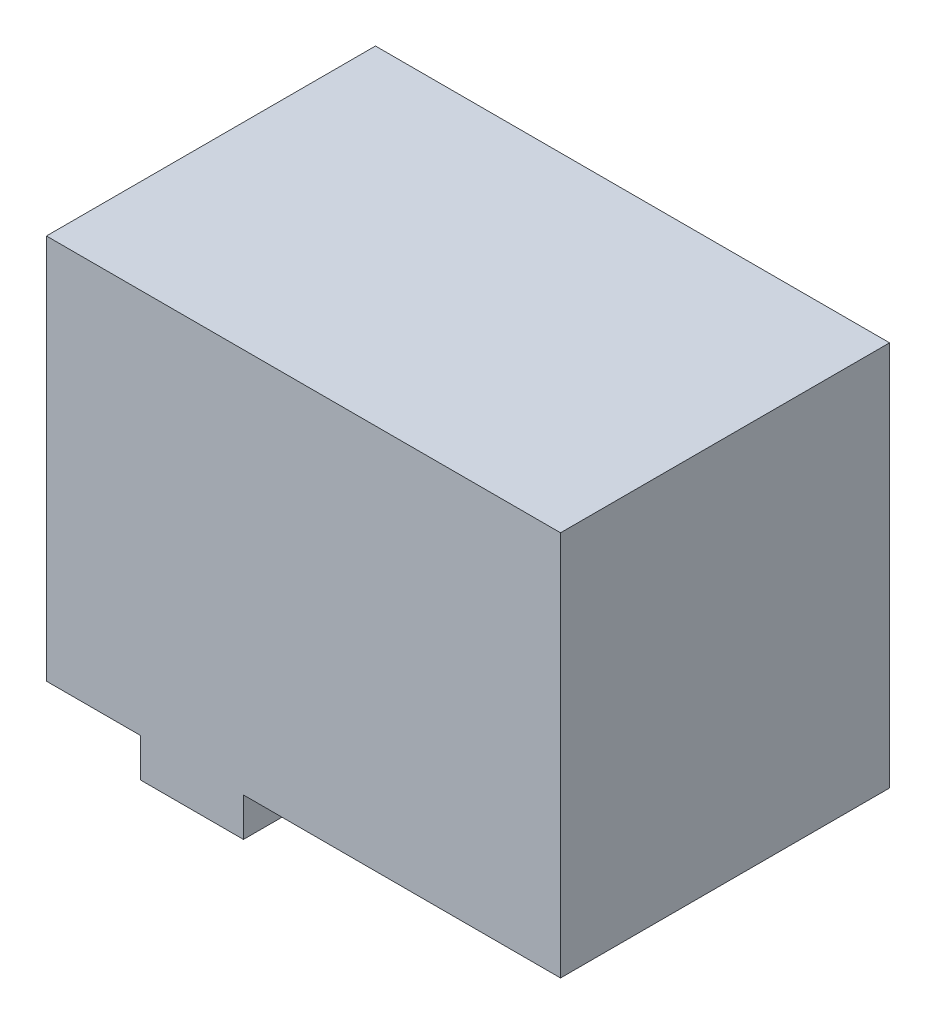
ISO-10303-21;
HEADER;
FILE_DESCRIPTION(('STEP AP214'),'2;1');
FILE_NAME('part.step','',(''),(''),'','','');
FILE_SCHEMA(('AUTOMOTIVE_DESIGN { 1 0 10303 214 1 1 1 1 }'));
ENDSEC;
DATA;
#1=APPLICATION_CONTEXT('core data for automotive mechanical design processes');
#2=APPLICATION_PROTOCOL_DEFINITION('international standard','automotive_design',2000,#1);
#3=PRODUCT_CONTEXT('',#1,'mechanical');
#4=PRODUCT('Part','Part','',(#3));
#5=PRODUCT_RELATED_PRODUCT_CATEGORY('part','',(#4));
#6=PRODUCT_DEFINITION_FORMATION('','',#4);
#7=PRODUCT_DEFINITION_CONTEXT('part definition',#1,'design');
#8=PRODUCT_DEFINITION('design','',#6,#7);
#9=PRODUCT_DEFINITION_SHAPE('','',#8);
#10=(LENGTH_UNIT() NAMED_UNIT(*) SI_UNIT(.MILLI.,.METRE.));
#11=(NAMED_UNIT(*) PLANE_ANGLE_UNIT() SI_UNIT($,.RADIAN.));
#12=(NAMED_UNIT(*) SI_UNIT($,.STERADIAN.) SOLID_ANGLE_UNIT());
#13=UNCERTAINTY_MEASURE_WITH_UNIT(LENGTH_MEASURE(1.E-05),#10,'distance_accuracy_value','');
#14=(GEOMETRIC_REPRESENTATION_CONTEXT(3) GLOBAL_UNCERTAINTY_ASSIGNED_CONTEXT((#13)) GLOBAL_UNIT_ASSIGNED_CONTEXT((#10,
#11,#12)) REPRESENTATION_CONTEXT('',''));
#15=CARTESIAN_POINT('',(0.,0.,0.));
#16=DIRECTION('',(0.,0.,1.));
#17=DIRECTION('',(1.,0.,0.));
#18=AXIS2_PLACEMENT_3D('',#15,#16,#17);
#19=CARTESIAN_POINT('',(0.,15.,-64.));
#20=DIRECTION('',(0.,-1.,0.));
#21=DIRECTION('',(0.,0.,-1.));
#22=AXIS2_PLACEMENT_3D('',#19,#20,#21);
#23=PLANE('',#22);
#24=DIRECTION('',(0.,0.,1.));
#25=VECTOR('',#24,1.);
#26=CARTESIAN_POINT('',(0.,15.,-64.));
#27=LINE('',#26,#25);
#28=CARTESIAN_POINT('',(0.,15.,-64.));
#29=VERTEX_POINT('',#28);
#30=CARTESIAN_POINT('',(0.,15.,64.));
#31=VERTEX_POINT('',#30);
#32=EDGE_CURVE('E49',#29,#31,#27,.T.);
#33=ORIENTED_EDGE('',*,*,#32,.T.);
#34=DIRECTION('',(1.,0.,0.));
#35=VECTOR('',#34,1.);
#36=CARTESIAN_POINT('',(0.,15.,64.));
#37=LINE('',#36,#35);
#38=CARTESIAN_POINT('',(-36.6542286394034,15.,64.));
#39=VERTEX_POINT('',#38);
#40=EDGE_CURVE('E191',#39,#31,#37,.T.);
#41=ORIENTED_EDGE('',*,*,#40,.F.);
#42=DIRECTION('',(0.,0.,1.));
#43=VECTOR('',#42,1.);
#44=CARTESIAN_POINT('',(-36.6542286394034,15.,-64.));
#45=LINE('',#44,#43);
#46=CARTESIAN_POINT('',(-36.6542286394034,15.,-64.));
#47=VERTEX_POINT('',#46);
#48=EDGE_CURVE('E11',#47,#39,#45,.T.);
#49=ORIENTED_EDGE('',*,*,#48,.F.);
#50=DIRECTION('',(1.,0.,0.));
#51=VECTOR('',#50,1.);
#52=CARTESIAN_POINT('',(0.,15.,-64.));
#53=LINE('',#52,#51);
#54=EDGE_CURVE('E283',#47,#29,#53,.T.);
#55=ORIENTED_EDGE('',*,*,#54,.T.);
#56=EDGE_LOOP('',(#33,#41,#49,#55));
#57=FACE_BOUND('',#56,.T.);
#58=ADVANCED_FACE('F45',(#57),#23,.T.);
#59=CARTESIAN_POINT('',(-36.6542286394034,0.,-64.));
#60=DIRECTION('',(1.,0.,0.));
#61=DIRECTION('',(0.,1.,0.));
#62=AXIS2_PLACEMENT_3D('',#59,#60,#61);
#63=PLANE('',#62);
#64=ORIENTED_EDGE('',*,*,#48,.T.);
#65=DIRECTION('',(0.,1.,0.));
#66=VECTOR('',#65,1.);
#67=CARTESIAN_POINT('',(-36.6542286394034,0.,64.));
#68=LINE('',#67,#66);
#69=CARTESIAN_POINT('',(-36.6542286394034,165.,64.));
#70=VERTEX_POINT('',#69);
#71=EDGE_CURVE('E279',#39,#70,#68,.T.);
#72=ORIENTED_EDGE('',*,*,#71,.T.);
#73=DIRECTION('',(0.,0.,1.));
#74=VECTOR('',#73,1.);
#75=CARTESIAN_POINT('',(-36.6542286394034,165.,-64.));
#76=LINE('',#75,#74);
#77=CARTESIAN_POINT('',(-36.6542286394034,165.,-64.));
#78=VERTEX_POINT('',#77);
#79=EDGE_CURVE('E55',#78,#70,#76,.T.);
#80=ORIENTED_EDGE('',*,*,#79,.F.);
#81=DIRECTION('',(0.,1.,0.));
#82=VECTOR('',#81,1.);
#83=CARTESIAN_POINT('',(-36.6542286394034,0.,-64.));
#84=LINE('',#83,#82);
#85=EDGE_CURVE('E306',#47,#78,#84,.T.);
#86=ORIENTED_EDGE('',*,*,#85,.F.);
#87=EDGE_LOOP('',(#64,#72,#80,#86));
#88=FACE_BOUND('',#87,.T.);
#89=ADVANCED_FACE('F336',(#88),#63,.F.);
#90=CARTESIAN_POINT('',(0.,165.,-64.));
#91=DIRECTION('',(0.,-1.,0.));
#92=DIRECTION('',(0.,0.,-1.));
#93=AXIS2_PLACEMENT_3D('',#90,#91,#92);
#94=PLANE('',#93);
#95=ORIENTED_EDGE('',*,*,#79,.T.);
#96=DIRECTION('',(1.,0.,0.));
#97=VECTOR('',#96,1.);
#98=CARTESIAN_POINT('',(0.,165.,64.));
#99=LINE('',#98,#97);
#100=CARTESIAN_POINT('',(163.345771360597,165.,64.));
#101=VERTEX_POINT('',#100);
#102=EDGE_CURVE('E275',#70,#101,#99,.T.);
#103=ORIENTED_EDGE('',*,*,#102,.T.);
#104=DIRECTION('',(0.,0.,1.));
#105=VECTOR('',#104,1.);
#106=CARTESIAN_POINT('',(163.345771360597,165.,-64.));
#107=LINE('',#106,#105);
#108=CARTESIAN_POINT('',(163.345771360597,165.,-64.));
#109=VERTEX_POINT('',#108);
#110=EDGE_CURVE('E311',#109,#101,#107,.T.);
#111=ORIENTED_EDGE('',*,*,#110,.F.);
#112=DIRECTION('',(1.,0.,0.));
#113=VECTOR('',#112,1.);
#114=CARTESIAN_POINT('',(0.,165.,-64.));
#115=LINE('',#114,#113);
#116=EDGE_CURVE('E303',#78,#109,#115,.T.);
#117=ORIENTED_EDGE('',*,*,#116,.F.);
#118=EDGE_LOOP('',(#95,#103,#111,#117));
#119=FACE_BOUND('',#118,.T.);
#120=ADVANCED_FACE('F361',(#119),#94,.F.);
#121=CARTESIAN_POINT('',(163.345771360597,0.,-64.));
#122=DIRECTION('',(1.,0.,0.));
#123=DIRECTION('',(0.,0.,-1.));
#124=AXIS2_PLACEMENT_3D('',#121,#122,#123);
#125=PLANE('',#124);
#126=ORIENTED_EDGE('',*,*,#110,.T.);
#127=DIRECTION('',(0.,1.,0.));
#128=VECTOR('',#127,1.);
#129=CARTESIAN_POINT('',(163.345771360597,0.,64.));
#130=LINE('',#129,#128);
#131=CARTESIAN_POINT('',(163.345771360597,15.,64.));
#132=VERTEX_POINT('',#131);
#133=EDGE_CURVE('E271',#132,#101,#130,.T.);
#134=ORIENTED_EDGE('',*,*,#133,.F.);
#135=DIRECTION('',(0.,0.,1.));
#136=VECTOR('',#135,1.);
#137=CARTESIAN_POINT('',(163.345771360597,15.,-64.));
#138=LINE('',#137,#136);
#139=CARTESIAN_POINT('',(163.345771360597,15.,-64.));
#140=VERTEX_POINT('',#139);
#141=EDGE_CURVE('E314',#140,#132,#138,.T.);
#142=ORIENTED_EDGE('',*,*,#141,.F.);
#143=DIRECTION('',(0.,1.,0.));
#144=VECTOR('',#143,1.);
#145=CARTESIAN_POINT('',(163.345771360597,0.,-64.));
#146=LINE('',#145,#144);
#147=EDGE_CURVE('E299',#140,#109,#146,.T.);
#148=ORIENTED_EDGE('',*,*,#147,.T.);
#149=EDGE_LOOP('',(#126,#134,#142,#148));
#150=FACE_BOUND('',#149,.T.);
#151=ADVANCED_FACE('F358',(#150),#125,.T.);
#152=ORIENTED_EDGE('',*,*,#141,.T.);
#153=CARTESIAN_POINT('',(40.,15.,64.));
#154=VERTEX_POINT('',#153);
#155=EDGE_CURVE('E259',#154,#132,#37,.T.);
#156=ORIENTED_EDGE('',*,*,#155,.F.);
#157=DIRECTION('',(0.,0.,1.));
#158=VECTOR('',#157,1.);
#159=CARTESIAN_POINT('',(40.,15.,-64.));
#160=LINE('',#159,#158);
#161=CARTESIAN_POINT('',(40.,15.,-64.));
#162=VERTEX_POINT('',#161);
#163=EDGE_CURVE('E317',#162,#154,#160,.T.);
#164=ORIENTED_EDGE('',*,*,#163,.F.);
#165=EDGE_CURVE('E287',#162,#140,#53,.T.);
#166=ORIENTED_EDGE('',*,*,#165,.T.);
#167=EDGE_LOOP('',(#152,#156,#164,#166));
#168=FACE_BOUND('',#167,.T.);
#169=ADVANCED_FACE('F352',(#168),#23,.T.);
#170=CARTESIAN_POINT('',(40.,0.,-64.));
#171=DIRECTION('',(1.,0.,0.));
#172=DIRECTION('',(0.,0.,-1.));
#173=AXIS2_PLACEMENT_3D('',#170,#171,#172);
#174=PLANE('',#173);
#175=ORIENTED_EDGE('',*,*,#163,.T.);
#176=DIRECTION('',(0.,1.,0.));
#177=VECTOR('',#176,1.);
#178=CARTESIAN_POINT('',(40.,0.,64.));
#179=LINE('',#178,#177);
#180=CARTESIAN_POINT('',(40.,0.,64.));
#181=VERTEX_POINT('',#180);
#182=EDGE_CURVE('E267',#181,#154,#179,.T.);
#183=ORIENTED_EDGE('',*,*,#182,.F.);
#184=DIRECTION('',(0.,0.,1.));
#185=VECTOR('',#184,1.);
#186=CARTESIAN_POINT('',(40.,0.,-64.));
#187=LINE('',#186,#185);
#188=CARTESIAN_POINT('',(40.,0.,-64.));
#189=VERTEX_POINT('',#188);
#190=EDGE_CURVE('E320',#189,#181,#187,.T.);
#191=ORIENTED_EDGE('',*,*,#190,.F.);
#192=DIRECTION('',(0.,1.,0.));
#193=VECTOR('',#192,1.);
#194=CARTESIAN_POINT('',(40.,0.,-64.));
#195=LINE('',#194,#193);
#196=EDGE_CURVE('E295',#189,#162,#195,.T.);
#197=ORIENTED_EDGE('',*,*,#196,.T.);
#198=EDGE_LOOP('',(#175,#183,#191,#197));
#199=FACE_BOUND('',#198,.T.);
#200=ADVANCED_FACE('F349',(#199),#174,.T.);
#201=CARTESIAN_POINT('',(0.,0.,-64.));
#202=DIRECTION('',(0.,-1.,0.));
#203=DIRECTION('',(0.,0.,-1.));
#204=AXIS2_PLACEMENT_3D('',#201,#202,#203);
#205=PLANE('',#204);
#206=DIRECTION('',(0.,0.,1.));
#207=VECTOR('',#206,1.);
#208=CARTESIAN_POINT('',(35.,0.,-64.));
#209=LINE('',#208,#207);
#210=CARTESIAN_POINT('',(35.,0.,-59.));
#211=VERTEX_POINT('',#210);
#212=CARTESIAN_POINT('',(35.,0.,59.));
#213=VERTEX_POINT('',#212);
#214=EDGE_CURVE('E233',#211,#213,#209,.T.);
#215=ORIENTED_EDGE('',*,*,#214,.F.);
#216=DIRECTION('',(1.,0.,0.));
#217=VECTOR('',#216,1.);
#218=CARTESIAN_POINT('',(0.,0.,-59.));
#219=LINE('',#218,#217);
#220=CARTESIAN_POINT('',(5.,0.,-59.));
#221=VERTEX_POINT('',#220);
#222=EDGE_CURVE('E244',#221,#211,#219,.T.);
#223=ORIENTED_EDGE('',*,*,#222,.F.);
#224=DIRECTION('',(0.,0.,1.));
#225=VECTOR('',#224,1.);
#226=CARTESIAN_POINT('',(5.,0.,-64.));
#227=LINE('',#226,#225);
#228=CARTESIAN_POINT('',(5.,0.,59.));
#229=VERTEX_POINT('',#228);
#230=EDGE_CURVE('E169',#221,#229,#227,.T.);
#231=ORIENTED_EDGE('',*,*,#230,.T.);
#232=DIRECTION('',(1.,0.,0.));
#233=VECTOR('',#232,1.);
#234=CARTESIAN_POINT('',(0.,0.,59.));
#235=LINE('',#234,#233);
#236=EDGE_CURVE('E180',#229,#213,#235,.T.);
#237=ORIENTED_EDGE('',*,*,#236,.T.);
#238=EDGE_LOOP('',(#215,#223,#231,#237));
#239=FACE_BOUND('',#238,.T.);
#240=ORIENTED_EDGE('',*,*,#190,.T.);
#241=DIRECTION('',(1.,0.,0.));
#242=VECTOR('',#241,1.);
#243=CARTESIAN_POINT('',(0.,0.,64.));
#244=LINE('',#243,#242);
#245=CARTESIAN_POINT('',(0.,0.,64.));
#246=VERTEX_POINT('',#245);
#247=EDGE_CURVE('E263',#246,#181,#244,.T.);
#248=ORIENTED_EDGE('',*,*,#247,.F.);
#249=DIRECTION('',(0.,0.,1.));
#250=VECTOR('',#249,1.);
#251=CARTESIAN_POINT('',(0.,0.,-64.));
#252=LINE('',#251,#250);
#253=CARTESIAN_POINT('',(0.,0.,-64.));
#254=VERTEX_POINT('',#253);
#255=EDGE_CURVE('E322',#254,#246,#252,.T.);
#256=ORIENTED_EDGE('',*,*,#255,.F.);
#257=DIRECTION('',(1.,0.,0.));
#258=VECTOR('',#257,1.);
#259=CARTESIAN_POINT('',(0.,0.,-64.));
#260=LINE('',#259,#258);
#261=EDGE_CURVE('E291',#254,#189,#260,.T.);
#262=ORIENTED_EDGE('',*,*,#261,.T.);
#263=EDGE_LOOP('',(#240,#248,#256,#262));
#264=FACE_BOUND('',#263,.T.);
#265=ADVANCED_FACE('F344',(#239,#264),#205,.T.);
#266=CARTESIAN_POINT('',(0.,0.,-64.));
#267=DIRECTION('',(-1.,0.,0.));
#268=DIRECTION('',(0.,0.,1.));
#269=AXIS2_PLACEMENT_3D('',#266,#267,#268);
#270=PLANE('',#269);
#271=ORIENTED_EDGE('',*,*,#255,.T.);
#272=DIRECTION('',(0.,-1.,0.));
#273=VECTOR('',#272,1.);
#274=CARTESIAN_POINT('',(0.,0.,64.));
#275=LINE('',#274,#273);
#276=EDGE_CURVE('E258',#31,#246,#275,.T.);
#277=ORIENTED_EDGE('',*,*,#276,.F.);
#278=ORIENTED_EDGE('',*,*,#32,.F.);
#279=DIRECTION('',(0.,-1.,0.));
#280=VECTOR('',#279,1.);
#281=CARTESIAN_POINT('',(0.,0.,-64.));
#282=LINE('',#281,#280);
#283=EDGE_CURVE('E286',#29,#254,#282,.T.);
#284=ORIENTED_EDGE('',*,*,#283,.T.);
#285=EDGE_LOOP('',(#271,#277,#278,#284));
#286=FACE_BOUND('',#285,.T.);
#287=ADVANCED_FACE('F47',(#286),#270,.T.);
#288=CARTESIAN_POINT('',(0.,0.,-64.));
#289=DIRECTION('',(0.,0.,1.));
#290=DIRECTION('',(1.,0.,0.));
#291=AXIS2_PLACEMENT_3D('',#288,#289,#290);
#292=PLANE('',#291);
#293=ORIENTED_EDGE('',*,*,#54,.F.);
#294=ORIENTED_EDGE('',*,*,#85,.T.);
#295=ORIENTED_EDGE('',*,*,#116,.T.);
#296=ORIENTED_EDGE('',*,*,#147,.F.);
#297=ORIENTED_EDGE('',*,*,#165,.F.);
#298=ORIENTED_EDGE('',*,*,#196,.F.);
#299=ORIENTED_EDGE('',*,*,#261,.F.);
#300=ORIENTED_EDGE('',*,*,#283,.F.);
#301=EDGE_LOOP('',(#293,#294,#295,#296,#297,#298,#299,#300));
#302=FACE_BOUND('',#301,.T.);
#303=ADVANCED_FACE('F339',(#302),#292,.F.);
#304=CARTESIAN_POINT('',(0.,0.,64.));
#305=DIRECTION('',(0.,0.,1.));
#306=DIRECTION('',(1.,0.,0.));
#307=AXIS2_PLACEMENT_3D('',#304,#305,#306);
#308=PLANE('',#307);
#309=ORIENTED_EDGE('',*,*,#40,.T.);
#310=ORIENTED_EDGE('',*,*,#276,.T.);
#311=ORIENTED_EDGE('',*,*,#247,.T.);
#312=ORIENTED_EDGE('',*,*,#182,.T.);
#313=ORIENTED_EDGE('',*,*,#155,.T.);
#314=ORIENTED_EDGE('',*,*,#133,.T.);
#315=ORIENTED_EDGE('',*,*,#102,.F.);
#316=ORIENTED_EDGE('',*,*,#71,.F.);
#317=EDGE_LOOP('',(#309,#310,#311,#312,#313,#314,#315,#316));
#318=FACE_BOUND('',#317,.T.);
#319=ADVANCED_FACE('F332',(#318),#308,.T.);
#320=CARTESIAN_POINT('',(0.,20.,-64.));
#321=DIRECTION('',(0.,-1.,0.));
#322=DIRECTION('',(0.,0.,-1.));
#323=AXIS2_PLACEMENT_3D('',#320,#321,#322);
#324=PLANE('',#323);
#325=DIRECTION('',(0.,0.,1.));
#326=VECTOR('',#325,1.);
#327=CARTESIAN_POINT('',(5.,20.,-64.));
#328=LINE('',#327,#326);
#329=CARTESIAN_POINT('',(5.,20.,-59.));
#330=VERTEX_POINT('',#329);
#331=CARTESIAN_POINT('',(5.,20.,59.));
#332=VERTEX_POINT('',#331);
#333=EDGE_CURVE('E160',#330,#332,#328,.T.);
#334=ORIENTED_EDGE('',*,*,#333,.F.);
#335=DIRECTION('',(1.,0.,0.));
#336=VECTOR('',#335,1.);
#337=CARTESIAN_POINT('',(0.,20.,-59.));
#338=LINE('',#337,#336);
#339=CARTESIAN_POINT('',(-31.6542286394034,20.,-59.));
#340=VERTEX_POINT('',#339);
#341=EDGE_CURVE('E193',#340,#330,#338,.T.);
#342=ORIENTED_EDGE('',*,*,#341,.F.);
#343=DIRECTION('',(0.,0.,1.));
#344=VECTOR('',#343,1.);
#345=CARTESIAN_POINT('',(-31.6542286394034,20.,-64.));
#346=LINE('',#345,#344);
#347=CARTESIAN_POINT('',(-31.6542286394034,20.,59.));
#348=VERTEX_POINT('',#347);
#349=EDGE_CURVE('E185',#340,#348,#346,.T.);
#350=ORIENTED_EDGE('',*,*,#349,.T.);
#351=DIRECTION('',(1.,0.,0.));
#352=VECTOR('',#351,1.);
#353=CARTESIAN_POINT('',(0.,20.,59.));
#354=LINE('',#353,#352);
#355=EDGE_CURVE('E176',#348,#332,#354,.T.);
#356=ORIENTED_EDGE('',*,*,#355,.T.);
#357=EDGE_LOOP('',(#334,#342,#350,#356));
#358=FACE_BOUND('',#357,.T.);
#359=ADVANCED_FACE('F184',(#358),#324,.F.);
#360=CARTESIAN_POINT('',(-31.6542286394034,0.,-64.));
#361=DIRECTION('',(1.,0.,0.));
#362=DIRECTION('',(0.,1.,0.));
#363=AXIS2_PLACEMENT_3D('',#360,#361,#362);
#364=PLANE('',#363);
#365=ORIENTED_EDGE('',*,*,#349,.F.);
#366=DIRECTION('',(0.,1.,0.));
#367=VECTOR('',#366,1.);
#368=CARTESIAN_POINT('',(-31.6542286394034,0.,-59.));
#369=LINE('',#368,#367);
#370=CARTESIAN_POINT('',(-31.6542286394034,160.,-59.));
#371=VERTEX_POINT('',#370);
#372=EDGE_CURVE('E170',#340,#371,#369,.T.);
#373=ORIENTED_EDGE('',*,*,#372,.T.);
#374=DIRECTION('',(0.,0.,1.));
#375=VECTOR('',#374,1.);
#376=CARTESIAN_POINT('',(-31.6542286394034,160.,-64.));
#377=LINE('',#376,#375);
#378=CARTESIAN_POINT('',(-31.6542286394034,160.,59.));
#379=VERTEX_POINT('',#378);
#380=EDGE_CURVE('E192',#371,#379,#377,.T.);
#381=ORIENTED_EDGE('',*,*,#380,.T.);
#382=DIRECTION('',(0.,1.,0.));
#383=VECTOR('',#382,1.);
#384=CARTESIAN_POINT('',(-31.6542286394034,0.,59.));
#385=LINE('',#384,#383);
#386=EDGE_CURVE('E196',#348,#379,#385,.T.);
#387=ORIENTED_EDGE('',*,*,#386,.F.);
#388=EDGE_LOOP('',(#365,#373,#381,#387));
#389=FACE_BOUND('',#388,.T.);
#390=ADVANCED_FACE('F432',(#389),#364,.T.);
#391=CARTESIAN_POINT('',(0.,160.,-64.));
#392=DIRECTION('',(0.,-1.,0.));
#393=DIRECTION('',(0.,0.,-1.));
#394=AXIS2_PLACEMENT_3D('',#391,#392,#393);
#395=PLANE('',#394);
#396=ORIENTED_EDGE('',*,*,#380,.F.);
#397=DIRECTION('',(1.,0.,0.));
#398=VECTOR('',#397,1.);
#399=CARTESIAN_POINT('',(0.,160.,-59.));
#400=LINE('',#399,#398);
#401=CARTESIAN_POINT('',(158.345771360597,160.,-59.));
#402=VERTEX_POINT('',#401);
#403=EDGE_CURVE('E205',#371,#402,#400,.T.);
#404=ORIENTED_EDGE('',*,*,#403,.T.);
#405=DIRECTION('',(0.,0.,1.));
#406=VECTOR('',#405,1.);
#407=CARTESIAN_POINT('',(158.345771360597,160.,-64.));
#408=LINE('',#407,#406);
#409=CARTESIAN_POINT('',(158.345771360597,160.,59.));
#410=VERTEX_POINT('',#409);
#411=EDGE_CURVE('E202',#402,#410,#408,.T.);
#412=ORIENTED_EDGE('',*,*,#411,.T.);
#413=DIRECTION('',(1.,0.,0.));
#414=VECTOR('',#413,1.);
#415=CARTESIAN_POINT('',(0.,160.,59.));
#416=LINE('',#415,#414);
#417=EDGE_CURVE('E199',#379,#410,#416,.T.);
#418=ORIENTED_EDGE('',*,*,#417,.F.);
#419=EDGE_LOOP('',(#396,#404,#412,#418));
#420=FACE_BOUND('',#419,.T.);
#421=ADVANCED_FACE('F441',(#420),#395,.T.);
#422=CARTESIAN_POINT('',(158.345771360597,0.,-64.));
#423=DIRECTION('',(1.,0.,0.));
#424=DIRECTION('',(0.,0.,-1.));
#425=AXIS2_PLACEMENT_3D('',#422,#423,#424);
#426=PLANE('',#425);
#427=ORIENTED_EDGE('',*,*,#411,.F.);
#428=DIRECTION('',(0.,1.,0.));
#429=VECTOR('',#428,1.);
#430=CARTESIAN_POINT('',(158.345771360597,0.,-59.));
#431=LINE('',#430,#429);
#432=CARTESIAN_POINT('',(158.345771360597,20.,-59.));
#433=VERTEX_POINT('',#432);
#434=EDGE_CURVE('E215',#433,#402,#431,.T.);
#435=ORIENTED_EDGE('',*,*,#434,.F.);
#436=DIRECTION('',(0.,0.,1.));
#437=VECTOR('',#436,1.);
#438=CARTESIAN_POINT('',(158.345771360597,20.,-64.));
#439=LINE('',#438,#437);
#440=CARTESIAN_POINT('',(158.345771360597,20.,59.));
#441=VERTEX_POINT('',#440);
#442=EDGE_CURVE('E212',#433,#441,#439,.T.);
#443=ORIENTED_EDGE('',*,*,#442,.T.);
#444=DIRECTION('',(0.,1.,0.));
#445=VECTOR('',#444,1.);
#446=CARTESIAN_POINT('',(158.345771360597,0.,59.));
#447=LINE('',#446,#445);
#448=EDGE_CURVE('E209',#441,#410,#447,.T.);
#449=ORIENTED_EDGE('',*,*,#448,.T.);
#450=EDGE_LOOP('',(#427,#435,#443,#449));
#451=FACE_BOUND('',#450,.T.);
#452=ADVANCED_FACE('F451',(#451),#426,.F.);
#453=ORIENTED_EDGE('',*,*,#442,.F.);
#454=DIRECTION('',(1.,0.,0.));
#455=VECTOR('',#454,1.);
#456=CARTESIAN_POINT('',(0.,20.,-59.));
#457=LINE('',#456,#455);
#458=CARTESIAN_POINT('',(35.,20.,-59.));
#459=VERTEX_POINT('',#458);
#460=EDGE_CURVE('E226',#459,#433,#457,.T.);
#461=ORIENTED_EDGE('',*,*,#460,.F.);
#462=DIRECTION('',(0.,0.,1.));
#463=VECTOR('',#462,1.);
#464=CARTESIAN_POINT('',(35.,20.,-64.));
#465=LINE('',#464,#463);
#466=CARTESIAN_POINT('',(35.,20.,59.));
#467=VERTEX_POINT('',#466);
#468=EDGE_CURVE('E222',#459,#467,#465,.T.);
#469=ORIENTED_EDGE('',*,*,#468,.T.);
#470=DIRECTION('',(1.,0.,0.));
#471=VECTOR('',#470,1.);
#472=CARTESIAN_POINT('',(0.,20.,59.));
#473=LINE('',#472,#471);
#474=EDGE_CURVE('E219',#467,#441,#473,.T.);
#475=ORIENTED_EDGE('',*,*,#474,.T.);
#476=EDGE_LOOP('',(#453,#461,#469,#475));
#477=FACE_BOUND('',#476,.T.);
#478=ADVANCED_FACE('F395',(#477),#324,.F.);
#479=CARTESIAN_POINT('',(35.,0.,-64.));
#480=DIRECTION('',(1.,0.,0.));
#481=DIRECTION('',(0.,0.,-1.));
#482=AXIS2_PLACEMENT_3D('',#479,#480,#481);
#483=PLANE('',#482);
#484=ORIENTED_EDGE('',*,*,#468,.F.);
#485=DIRECTION('',(0.,1.,0.));
#486=VECTOR('',#485,1.);
#487=CARTESIAN_POINT('',(35.,0.,-59.));
#488=LINE('',#487,#486);
#489=EDGE_CURVE('E237',#211,#459,#488,.T.);
#490=ORIENTED_EDGE('',*,*,#489,.F.);
#491=ORIENTED_EDGE('',*,*,#214,.T.);
#492=DIRECTION('',(0.,1.,0.));
#493=VECTOR('',#492,1.);
#494=CARTESIAN_POINT('',(35.,0.,59.));
#495=LINE('',#494,#493);
#496=EDGE_CURVE('E230',#213,#467,#495,.T.);
#497=ORIENTED_EDGE('',*,*,#496,.T.);
#498=EDGE_LOOP('',(#484,#490,#491,#497));
#499=FACE_BOUND('',#498,.T.);
#500=ADVANCED_FACE('F391',(#499),#483,.F.);
#501=CARTESIAN_POINT('',(5.,0.,-64.));
#502=DIRECTION('',(-1.,0.,0.));
#503=DIRECTION('',(0.,0.,1.));
#504=AXIS2_PLACEMENT_3D('',#501,#502,#503);
#505=PLANE('',#504);
#506=ORIENTED_EDGE('',*,*,#230,.F.);
#507=DIRECTION('',(0.,-1.,0.));
#508=VECTOR('',#507,1.);
#509=CARTESIAN_POINT('',(5.,0.,-59.));
#510=LINE('',#509,#508);
#511=EDGE_CURVE('E63',#330,#221,#510,.T.);
#512=ORIENTED_EDGE('',*,*,#511,.F.);
#513=ORIENTED_EDGE('',*,*,#333,.T.);
#514=DIRECTION('',(0.,-1.,0.));
#515=VECTOR('',#514,1.);
#516=CARTESIAN_POINT('',(5.,0.,59.));
#517=LINE('',#516,#515);
#518=EDGE_CURVE('E163',#332,#229,#517,.T.);
#519=ORIENTED_EDGE('',*,*,#518,.T.);
#520=EDGE_LOOP('',(#506,#512,#513,#519));
#521=FACE_BOUND('',#520,.T.);
#522=ADVANCED_FACE('F162',(#521),#505,.F.);
#523=CARTESIAN_POINT('',(0.,0.,-59.));
#524=DIRECTION('',(0.,0.,1.));
#525=DIRECTION('',(1.,0.,0.));
#526=AXIS2_PLACEMENT_3D('',#523,#524,#525);
#527=PLANE('',#526);
#528=ORIENTED_EDGE('',*,*,#341,.T.);
#529=ORIENTED_EDGE('',*,*,#511,.T.);
#530=ORIENTED_EDGE('',*,*,#222,.T.);
#531=ORIENTED_EDGE('',*,*,#489,.T.);
#532=ORIENTED_EDGE('',*,*,#460,.T.);
#533=ORIENTED_EDGE('',*,*,#434,.T.);
#534=ORIENTED_EDGE('',*,*,#403,.F.);
#535=ORIENTED_EDGE('',*,*,#372,.F.);
#536=EDGE_LOOP('',(#528,#529,#530,#531,#532,#533,#534,#535));
#537=FACE_BOUND('',#536,.T.);
#538=ADVANCED_FACE('F398',(#537),#527,.T.);
#539=CARTESIAN_POINT('',(0.,0.,59.));
#540=DIRECTION('',(0.,0.,1.));
#541=DIRECTION('',(1.,0.,0.));
#542=AXIS2_PLACEMENT_3D('',#539,#540,#541);
#543=PLANE('',#542);
#544=ORIENTED_EDGE('',*,*,#355,.F.);
#545=ORIENTED_EDGE('',*,*,#386,.T.);
#546=ORIENTED_EDGE('',*,*,#417,.T.);
#547=ORIENTED_EDGE('',*,*,#448,.F.);
#548=ORIENTED_EDGE('',*,*,#474,.F.);
#549=ORIENTED_EDGE('',*,*,#496,.F.);
#550=ORIENTED_EDGE('',*,*,#236,.F.);
#551=ORIENTED_EDGE('',*,*,#518,.F.);
#552=EDGE_LOOP('',(#544,#545,#546,#547,#548,#549,#550,#551));
#553=FACE_BOUND('',#552,.T.);
#554=ADVANCED_FACE('F174',(#553),#543,.F.);
#555=CLOSED_SHELL('',(#58,#89,#120,#151,#169,#200,#265,#287,#303,#319,#359,#390,#421,#452,#478,
#500,#522,#538,#554));
#556=MANIFOLD_SOLID_BREP('B2',#555);
#557=ADVANCED_BREP_SHAPE_REPRESENTATION('',(#18,#556),#14);
#558=SHAPE_DEFINITION_REPRESENTATION(#9,#557);
ENDSEC;
END-ISO-10303-21;
